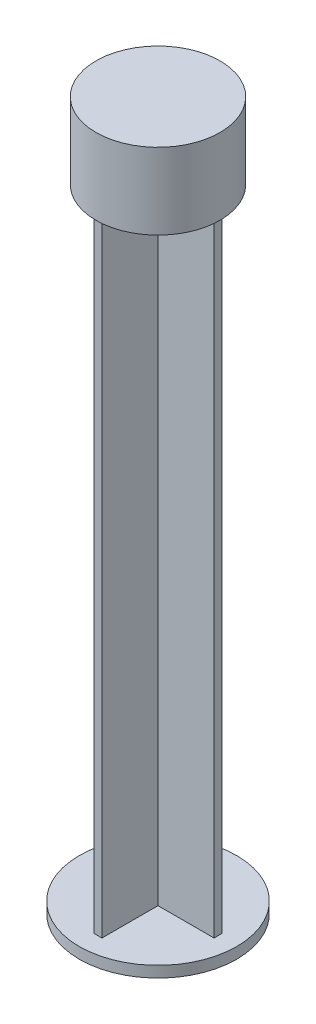
ISO-10303-21;
HEADER;
FILE_DESCRIPTION(('STEP AP214'),'2;1');
FILE_NAME('part.step','',(''),(''),'','','');
FILE_SCHEMA(('AUTOMOTIVE_DESIGN { 1 0 10303 214 1 1 1 1 }'));
ENDSEC;
DATA;
#1=APPLICATION_CONTEXT('core data for automotive mechanical design processes');
#2=APPLICATION_PROTOCOL_DEFINITION('international standard','automotive_design',2000,#1);
#3=PRODUCT_CONTEXT('',#1,'mechanical');
#4=PRODUCT('Part','Part','',(#3));
#5=PRODUCT_RELATED_PRODUCT_CATEGORY('part','',(#4));
#6=PRODUCT_DEFINITION_FORMATION('','',#4);
#7=PRODUCT_DEFINITION_CONTEXT('part definition',#1,'design');
#8=PRODUCT_DEFINITION('design','',#6,#7);
#9=PRODUCT_DEFINITION_SHAPE('','',#8);
#10=(LENGTH_UNIT() NAMED_UNIT(*) SI_UNIT(.MILLI.,.METRE.));
#11=(NAMED_UNIT(*) PLANE_ANGLE_UNIT() SI_UNIT($,.RADIAN.));
#12=(NAMED_UNIT(*) SI_UNIT($,.STERADIAN.) SOLID_ANGLE_UNIT());
#13=UNCERTAINTY_MEASURE_WITH_UNIT(LENGTH_MEASURE(1.E-05),#10,'distance_accuracy_value','');
#14=(GEOMETRIC_REPRESENTATION_CONTEXT(3) GLOBAL_UNCERTAINTY_ASSIGNED_CONTEXT((#13)) GLOBAL_UNIT_ASSIGNED_CONTEXT((#10,
#11,#12)) REPRESENTATION_CONTEXT('',''));
#15=CARTESIAN_POINT('',(0.,0.,0.));
#16=DIRECTION('',(0.,0.,1.));
#17=DIRECTION('',(1.,0.,0.));
#18=AXIS2_PLACEMENT_3D('',#15,#16,#17);
#19=CARTESIAN_POINT('',(0.,2.76,0.));
#20=DIRECTION('',(0.,-1.,0.));
#21=DIRECTION('',(0.,0.,-1.));
#22=AXIS2_PLACEMENT_3D('',#19,#20,#21);
#23=CYLINDRICAL_SURFACE('',#22,19.675);
#24=CARTESIAN_POINT('',(0.,2.76,0.));
#25=DIRECTION('',(0.,1.,0.));
#26=DIRECTION('',(0.,0.,1.));
#27=AXIS2_PLACEMENT_3D('',#24,#25,#26);
#28=CIRCLE('',#27,19.675);
#29=CARTESIAN_POINT('',(0.,2.76,19.675));
#30=VERTEX_POINT('',#29);
#31=EDGE_CURVE('E11',#30,#30,#28,.T.);
#32=ORIENTED_EDGE('',*,*,#31,.F.);
#33=EDGE_LOOP('',(#32));
#34=FACE_BOUND('',#33,.T.);
#35=CARTESIAN_POINT('',(0.,0.,0.));
#36=DIRECTION('',(0.,1.,0.));
#37=DIRECTION('',(0.,0.,1.));
#38=AXIS2_PLACEMENT_3D('',#35,#36,#37);
#39=CIRCLE('',#38,19.675);
#40=CARTESIAN_POINT('',(0.,0.,19.675));
#41=VERTEX_POINT('',#40);
#42=EDGE_CURVE('E44',#41,#41,#39,.T.);
#43=ORIENTED_EDGE('',*,*,#42,.T.);
#44=EDGE_LOOP('',(#43));
#45=FACE_BOUND('',#44,.T.);
#46=ADVANCED_FACE('F41',(#34,#45),#23,.T.);
#47=CARTESIAN_POINT('',(0.,2.76,0.));
#48=DIRECTION('',(0.,1.,0.));
#49=DIRECTION('',(0.,0.,1.));
#50=AXIS2_PLACEMENT_3D('',#47,#48,#49);
#51=PLANE('',#50);
#52=DIRECTION('',(0.,0.,-1.));
#53=VECTOR('',#52,1.);
#54=CARTESIAN_POINT('',(-1.,2.76,0.));
#55=LINE('',#54,#53);
#56=CARTESIAN_POINT('',(-1.,2.76,-1.00000000000001));
#57=VERTEX_POINT('',#56);
#58=CARTESIAN_POINT('',(-1.,2.76,-15.));
#59=VERTEX_POINT('',#58);
#60=EDGE_CURVE('E197',#57,#59,#55,.T.);
#61=ORIENTED_EDGE('',*,*,#60,.T.);
#62=DIRECTION('',(1.,0.,0.));
#63=VECTOR('',#62,1.);
#64=CARTESIAN_POINT('',(0.,2.76,-15.));
#65=LINE('',#64,#63);
#66=CARTESIAN_POINT('',(1.,2.76,-15.));
#67=VERTEX_POINT('',#66);
#68=EDGE_CURVE('E146',#59,#67,#65,.T.);
#69=ORIENTED_EDGE('',*,*,#68,.T.);
#70=DIRECTION('',(0.,0.,-1.));
#71=VECTOR('',#70,1.);
#72=CARTESIAN_POINT('',(1.,2.76,0.));
#73=LINE('',#72,#71);
#74=CARTESIAN_POINT('',(1.,2.76,-1.00000000000001));
#75=VERTEX_POINT('',#74);
#76=EDGE_CURVE('E162',#75,#67,#73,.T.);
#77=ORIENTED_EDGE('',*,*,#76,.F.);
#78=DIRECTION('',(-1.,0.,0.));
#79=VECTOR('',#78,1.);
#80=CARTESIAN_POINT('',(0.,2.76,-1.00000000000001));
#81=LINE('',#80,#79);
#82=CARTESIAN_POINT('',(15.,2.76,-1.00000000000001));
#83=VERTEX_POINT('',#82);
#84=EDGE_CURVE('E226',#83,#75,#81,.T.);
#85=ORIENTED_EDGE('',*,*,#84,.F.);
#86=DIRECTION('',(0.,0.,-1.));
#87=VECTOR('',#86,1.);
#88=CARTESIAN_POINT('',(15.,2.76,0.));
#89=LINE('',#88,#87);
#90=CARTESIAN_POINT('',(15.,2.76,0.999999999999989));
#91=VERTEX_POINT('',#90);
#92=EDGE_CURVE('E222',#91,#83,#89,.T.);
#93=ORIENTED_EDGE('',*,*,#92,.F.);
#94=DIRECTION('',(-1.,0.,0.));
#95=VECTOR('',#94,1.);
#96=CARTESIAN_POINT('',(0.,2.76,0.999999999999991));
#97=LINE('',#96,#95);
#98=CARTESIAN_POINT('',(1.,2.76,0.999999999999991));
#99=VERTEX_POINT('',#98);
#100=EDGE_CURVE('E219',#91,#99,#97,.T.);
#101=ORIENTED_EDGE('',*,*,#100,.T.);
#102=DIRECTION('',(0.,0.,-1.));
#103=VECTOR('',#102,1.);
#104=CARTESIAN_POINT('',(1.,2.76,0.));
#105=LINE('',#104,#103);
#106=CARTESIAN_POINT('',(1.,2.76,15.));
#107=VERTEX_POINT('',#106);
#108=EDGE_CURVE('E215',#107,#99,#105,.T.);
#109=ORIENTED_EDGE('',*,*,#108,.F.);
#110=DIRECTION('',(1.,0.,0.));
#111=VECTOR('',#110,1.);
#112=CARTESIAN_POINT('',(0.,2.76,15.));
#113=LINE('',#112,#111);
#114=CARTESIAN_POINT('',(-1.,2.76,15.));
#115=VERTEX_POINT('',#114);
#116=EDGE_CURVE('E211',#115,#107,#113,.T.);
#117=ORIENTED_EDGE('',*,*,#116,.F.);
#118=DIRECTION('',(0.,0.,-1.));
#119=VECTOR('',#118,1.);
#120=CARTESIAN_POINT('',(-1.,2.76,0.));
#121=LINE('',#120,#119);
#122=CARTESIAN_POINT('',(-1.,2.76,0.999999999999991));
#123=VERTEX_POINT('',#122);
#124=EDGE_CURVE('E208',#115,#123,#121,.T.);
#125=ORIENTED_EDGE('',*,*,#124,.T.);
#126=DIRECTION('',(-1.,0.,0.));
#127=VECTOR('',#126,1.);
#128=CARTESIAN_POINT('',(0.,2.76,0.999999999999991));
#129=LINE('',#128,#127);
#130=CARTESIAN_POINT('',(-15.,2.76,0.999999999999993));
#131=VERTEX_POINT('',#130);
#132=EDGE_CURVE('E205',#123,#131,#129,.T.);
#133=ORIENTED_EDGE('',*,*,#132,.T.);
#134=DIRECTION('',(0.,0.,-1.));
#135=VECTOR('',#134,1.);
#136=CARTESIAN_POINT('',(-15.,2.76,0.));
#137=LINE('',#136,#135);
#138=CARTESIAN_POINT('',(-15.,2.76,-1.00000000000001));
#139=VERTEX_POINT('',#138);
#140=EDGE_CURVE('E61',#131,#139,#137,.T.);
#141=ORIENTED_EDGE('',*,*,#140,.T.);
#142=DIRECTION('',(-1.,0.,0.));
#143=VECTOR('',#142,1.);
#144=CARTESIAN_POINT('',(0.,2.76,-1.00000000000001));
#145=LINE('',#144,#143);
#146=EDGE_CURVE('E56',#57,#139,#145,.T.);
#147=ORIENTED_EDGE('',*,*,#146,.F.);
#148=EDGE_LOOP('',(#61,#69,#77,#85,#93,#101,#109,#117,#125,#133,#141,#147));
#149=FACE_BOUND('',#148,.T.);
#150=ORIENTED_EDGE('',*,*,#31,.T.);
#151=EDGE_LOOP('',(#150));
#152=FACE_BOUND('',#151,.T.);
#153=ADVANCED_FACE('F279',(#149,#152),#51,.T.);
#154=CARTESIAN_POINT('',(0.,0.,0.));
#155=DIRECTION('',(0.,1.,0.));
#156=DIRECTION('',(0.,0.,1.));
#157=AXIS2_PLACEMENT_3D('',#154,#155,#156);
#158=PLANE('',#157);
#159=ORIENTED_EDGE('',*,*,#42,.F.);
#160=EDGE_LOOP('',(#159));
#161=FACE_BOUND('',#160,.T.);
#162=ADVANCED_FACE('F277',(#161),#158,.F.);
#163=CARTESIAN_POINT('',(-1.,157.76,0.));
#164=DIRECTION('',(-1.,0.,0.));
#165=DIRECTION('',(0.,0.,1.));
#166=AXIS2_PLACEMENT_3D('',#163,#164,#165);
#167=PLANE('',#166);
#168=ORIENTED_EDGE('',*,*,#60,.F.);
#169=DIRECTION('',(0.,-1.,0.));
#170=VECTOR('',#169,1.);
#171=CARTESIAN_POINT('',(-1.,157.76,-1.00000000000001));
#172=LINE('',#171,#170);
#173=CARTESIAN_POINT('',(-1.,157.76,-1.00000000000001));
#174=VERTEX_POINT('',#173);
#175=EDGE_CURVE('E153',#174,#57,#172,.T.);
#176=ORIENTED_EDGE('',*,*,#175,.F.);
#177=DIRECTION('',(0.,0.,-1.));
#178=VECTOR('',#177,1.);
#179=CARTESIAN_POINT('',(-1.,157.76,0.));
#180=LINE('',#179,#178);
#181=CARTESIAN_POINT('',(-1.,157.76,-15.));
#182=VERTEX_POINT('',#181);
#183=EDGE_CURVE('E133',#174,#182,#180,.T.);
#184=ORIENTED_EDGE('',*,*,#183,.T.);
#185=DIRECTION('',(0.,-1.,0.));
#186=VECTOR('',#185,1.);
#187=CARTESIAN_POINT('',(-1.,157.76,-15.));
#188=LINE('',#187,#186);
#189=EDGE_CURVE('E141',#182,#59,#188,.T.);
#190=ORIENTED_EDGE('',*,*,#189,.T.);
#191=EDGE_LOOP('',(#168,#176,#184,#190));
#192=FACE_BOUND('',#191,.T.);
#193=ADVANCED_FACE('F152',(#192),#167,.T.);
#194=CARTESIAN_POINT('',(0.,157.76,-1.00000000000001));
#195=DIRECTION('',(0.,0.,1.));
#196=DIRECTION('',(1.,0.,0.));
#197=AXIS2_PLACEMENT_3D('',#194,#195,#196);
#198=PLANE('',#197);
#199=ORIENTED_EDGE('',*,*,#146,.T.);
#200=DIRECTION('',(0.,-1.,0.));
#201=VECTOR('',#200,1.);
#202=CARTESIAN_POINT('',(-15.,157.76,-1.00000000000001));
#203=LINE('',#202,#201);
#204=CARTESIAN_POINT('',(-15.,157.76,-1.00000000000001));
#205=VERTEX_POINT('',#204);
#206=EDGE_CURVE('E267',#205,#139,#203,.T.);
#207=ORIENTED_EDGE('',*,*,#206,.F.);
#208=DIRECTION('',(-1.,0.,0.));
#209=VECTOR('',#208,1.);
#210=CARTESIAN_POINT('',(0.,157.76,-1.00000000000001));
#211=LINE('',#210,#209);
#212=EDGE_CURVE('E156',#174,#205,#211,.T.);
#213=ORIENTED_EDGE('',*,*,#212,.F.);
#214=ORIENTED_EDGE('',*,*,#175,.T.);
#215=EDGE_LOOP('',(#199,#207,#213,#214));
#216=FACE_BOUND('',#215,.T.);
#217=ADVANCED_FACE('F284',(#216),#198,.F.);
#218=CARTESIAN_POINT('',(-15.,157.76,0.));
#219=DIRECTION('',(-1.,0.,0.));
#220=DIRECTION('',(0.,0.,1.));
#221=AXIS2_PLACEMENT_3D('',#218,#219,#220);
#222=PLANE('',#221);
#223=ORIENTED_EDGE('',*,*,#140,.F.);
#224=DIRECTION('',(0.,-1.,0.));
#225=VECTOR('',#224,1.);
#226=CARTESIAN_POINT('',(-15.,157.76,0.999999999999993));
#227=LINE('',#226,#225);
#228=CARTESIAN_POINT('',(-15.,157.76,0.999999999999993));
#229=VERTEX_POINT('',#228);
#230=EDGE_CURVE('E263',#229,#131,#227,.T.);
#231=ORIENTED_EDGE('',*,*,#230,.F.);
#232=DIRECTION('',(0.,0.,-1.));
#233=VECTOR('',#232,1.);
#234=CARTESIAN_POINT('',(-15.,157.76,0.));
#235=LINE('',#234,#233);
#236=EDGE_CURVE('E160',#229,#205,#235,.T.);
#237=ORIENTED_EDGE('',*,*,#236,.T.);
#238=ORIENTED_EDGE('',*,*,#206,.T.);
#239=EDGE_LOOP('',(#223,#231,#237,#238));
#240=FACE_BOUND('',#239,.T.);
#241=ADVANCED_FACE('F314',(#240),#222,.T.);
#242=CARTESIAN_POINT('',(0.,157.76,0.999999999999991));
#243=DIRECTION('',(0.,0.,1.));
#244=DIRECTION('',(1.,0.,0.));
#245=AXIS2_PLACEMENT_3D('',#242,#243,#244);
#246=PLANE('',#245);
#247=ORIENTED_EDGE('',*,*,#132,.F.);
#248=DIRECTION('',(0.,-1.,0.));
#249=VECTOR('',#248,1.);
#250=CARTESIAN_POINT('',(-1.,157.76,0.999999999999991));
#251=LINE('',#250,#249);
#252=CARTESIAN_POINT('',(-1.,157.76,0.999999999999991));
#253=VERTEX_POINT('',#252);
#254=EDGE_CURVE('E259',#253,#123,#251,.T.);
#255=ORIENTED_EDGE('',*,*,#254,.F.);
#256=DIRECTION('',(-1.,0.,0.));
#257=VECTOR('',#256,1.);
#258=CARTESIAN_POINT('',(0.,157.76,0.999999999999991));
#259=LINE('',#258,#257);
#260=EDGE_CURVE('E171',#253,#229,#259,.T.);
#261=ORIENTED_EDGE('',*,*,#260,.T.);
#262=ORIENTED_EDGE('',*,*,#230,.T.);
#263=EDGE_LOOP('',(#247,#255,#261,#262));
#264=FACE_BOUND('',#263,.T.);
#265=ADVANCED_FACE('F323',(#264),#246,.T.);
#266=CARTESIAN_POINT('',(-1.,157.76,0.));
#267=DIRECTION('',(-1.,0.,0.));
#268=DIRECTION('',(0.,0.,1.));
#269=AXIS2_PLACEMENT_3D('',#266,#267,#268);
#270=PLANE('',#269);
#271=ORIENTED_EDGE('',*,*,#124,.F.);
#272=DIRECTION('',(0.,-1.,0.));
#273=VECTOR('',#272,1.);
#274=CARTESIAN_POINT('',(-1.,157.76,15.));
#275=LINE('',#274,#273);
#276=CARTESIAN_POINT('',(-1.,157.76,15.));
#277=VERTEX_POINT('',#276);
#278=EDGE_CURVE('E255',#277,#115,#275,.T.);
#279=ORIENTED_EDGE('',*,*,#278,.F.);
#280=DIRECTION('',(0.,0.,-1.));
#281=VECTOR('',#280,1.);
#282=CARTESIAN_POINT('',(-1.,157.76,0.));
#283=LINE('',#282,#281);
#284=EDGE_CURVE('E175',#277,#253,#283,.T.);
#285=ORIENTED_EDGE('',*,*,#284,.T.);
#286=ORIENTED_EDGE('',*,*,#254,.T.);
#287=EDGE_LOOP('',(#271,#279,#285,#286));
#288=FACE_BOUND('',#287,.T.);
#289=ADVANCED_FACE('F333',(#288),#270,.T.);
#290=CARTESIAN_POINT('',(0.,157.76,15.));
#291=DIRECTION('',(0.,0.,-1.));
#292=DIRECTION('',(-1.,0.,0.));
#293=AXIS2_PLACEMENT_3D('',#290,#291,#292);
#294=PLANE('',#293);
#295=ORIENTED_EDGE('',*,*,#116,.T.);
#296=DIRECTION('',(0.,-1.,0.));
#297=VECTOR('',#296,1.);
#298=CARTESIAN_POINT('',(1.,157.76,15.));
#299=LINE('',#298,#297);
#300=CARTESIAN_POINT('',(1.,157.76,15.));
#301=VERTEX_POINT('',#300);
#302=EDGE_CURVE('E251',#301,#107,#299,.T.);
#303=ORIENTED_EDGE('',*,*,#302,.F.);
#304=DIRECTION('',(1.,0.,0.));
#305=VECTOR('',#304,1.);
#306=CARTESIAN_POINT('',(0.,157.76,15.));
#307=LINE('',#306,#305);
#308=EDGE_CURVE('E179',#277,#301,#307,.T.);
#309=ORIENTED_EDGE('',*,*,#308,.F.);
#310=ORIENTED_EDGE('',*,*,#278,.T.);
#311=EDGE_LOOP('',(#295,#303,#309,#310));
#312=FACE_BOUND('',#311,.T.);
#313=ADVANCED_FACE('F343',(#312),#294,.F.);
#314=CARTESIAN_POINT('',(1.,157.76,0.));
#315=DIRECTION('',(-1.,0.,0.));
#316=DIRECTION('',(0.,0.,1.));
#317=AXIS2_PLACEMENT_3D('',#314,#315,#316);
#318=PLANE('',#317);
#319=ORIENTED_EDGE('',*,*,#108,.T.);
#320=DIRECTION('',(0.,-1.,0.));
#321=VECTOR('',#320,1.);
#322=CARTESIAN_POINT('',(1.,157.76,0.999999999999991));
#323=LINE('',#322,#321);
#324=CARTESIAN_POINT('',(1.,157.76,0.999999999999991));
#325=VERTEX_POINT('',#324);
#326=EDGE_CURVE('E247',#325,#99,#323,.T.);
#327=ORIENTED_EDGE('',*,*,#326,.F.);
#328=DIRECTION('',(0.,0.,-1.));
#329=VECTOR('',#328,1.);
#330=CARTESIAN_POINT('',(1.,157.76,0.));
#331=LINE('',#330,#329);
#332=EDGE_CURVE('E182',#301,#325,#331,.T.);
#333=ORIENTED_EDGE('',*,*,#332,.F.);
#334=ORIENTED_EDGE('',*,*,#302,.T.);
#335=EDGE_LOOP('',(#319,#327,#333,#334));
#336=FACE_BOUND('',#335,.T.);
#337=ADVANCED_FACE('F353',(#336),#318,.F.);
#338=CARTESIAN_POINT('',(0.,157.76,0.999999999999991));
#339=DIRECTION('',(0.,0.,1.));
#340=DIRECTION('',(1.,0.,0.));
#341=AXIS2_PLACEMENT_3D('',#338,#339,#340);
#342=PLANE('',#341);
#343=ORIENTED_EDGE('',*,*,#100,.F.);
#344=DIRECTION('',(0.,-1.,0.));
#345=VECTOR('',#344,1.);
#346=CARTESIAN_POINT('',(15.,157.76,0.999999999999989));
#347=LINE('',#346,#345);
#348=CARTESIAN_POINT('',(15.,157.76,0.999999999999989));
#349=VERTEX_POINT('',#348);
#350=EDGE_CURVE('E243',#349,#91,#347,.T.);
#351=ORIENTED_EDGE('',*,*,#350,.F.);
#352=DIRECTION('',(-1.,0.,0.));
#353=VECTOR('',#352,1.);
#354=CARTESIAN_POINT('',(0.,157.76,0.999999999999991));
#355=LINE('',#354,#353);
#356=EDGE_CURVE('E185',#349,#325,#355,.T.);
#357=ORIENTED_EDGE('',*,*,#356,.T.);
#358=ORIENTED_EDGE('',*,*,#326,.T.);
#359=EDGE_LOOP('',(#343,#351,#357,#358));
#360=FACE_BOUND('',#359,.T.);
#361=ADVANCED_FACE('F363',(#360),#342,.T.);
#362=CARTESIAN_POINT('',(15.,157.76,0.));
#363=DIRECTION('',(-1.,0.,0.));
#364=DIRECTION('',(0.,0.,1.));
#365=AXIS2_PLACEMENT_3D('',#362,#363,#364);
#366=PLANE('',#365);
#367=ORIENTED_EDGE('',*,*,#92,.T.);
#368=DIRECTION('',(0.,-1.,0.));
#369=VECTOR('',#368,1.);
#370=CARTESIAN_POINT('',(15.,157.76,-1.00000000000001));
#371=LINE('',#370,#369);
#372=CARTESIAN_POINT('',(15.,157.76,-1.00000000000001));
#373=VERTEX_POINT('',#372);
#374=EDGE_CURVE('E239',#373,#83,#371,.T.);
#375=ORIENTED_EDGE('',*,*,#374,.F.);
#376=DIRECTION('',(0.,0.,-1.));
#377=VECTOR('',#376,1.);
#378=CARTESIAN_POINT('',(15.,157.76,0.));
#379=LINE('',#378,#377);
#380=EDGE_CURVE('E189',#349,#373,#379,.T.);
#381=ORIENTED_EDGE('',*,*,#380,.F.);
#382=ORIENTED_EDGE('',*,*,#350,.T.);
#383=EDGE_LOOP('',(#367,#375,#381,#382));
#384=FACE_BOUND('',#383,.T.);
#385=ADVANCED_FACE('F373',(#384),#366,.F.);
#386=CARTESIAN_POINT('',(0.,157.76,-1.00000000000001));
#387=DIRECTION('',(0.,0.,1.));
#388=DIRECTION('',(1.,0.,0.));
#389=AXIS2_PLACEMENT_3D('',#386,#387,#388);
#390=PLANE('',#389);
#391=ORIENTED_EDGE('',*,*,#84,.T.);
#392=DIRECTION('',(0.,-1.,0.));
#393=VECTOR('',#392,1.);
#394=CARTESIAN_POINT('',(1.,157.76,-1.00000000000001));
#395=LINE('',#394,#393);
#396=CARTESIAN_POINT('',(1.,157.76,-1.00000000000001));
#397=VERTEX_POINT('',#396);
#398=EDGE_CURVE('E235',#397,#75,#395,.T.);
#399=ORIENTED_EDGE('',*,*,#398,.F.);
#400=DIRECTION('',(-1.,0.,0.));
#401=VECTOR('',#400,1.);
#402=CARTESIAN_POINT('',(0.,157.76,-1.00000000000001));
#403=LINE('',#402,#401);
#404=EDGE_CURVE('E192',#373,#397,#403,.T.);
#405=ORIENTED_EDGE('',*,*,#404,.F.);
#406=ORIENTED_EDGE('',*,*,#374,.T.);
#407=EDGE_LOOP('',(#391,#399,#405,#406));
#408=FACE_BOUND('',#407,.T.);
#409=ADVANCED_FACE('F383',(#408),#390,.F.);
#410=CARTESIAN_POINT('',(1.,157.76,0.));
#411=DIRECTION('',(-1.,0.,0.));
#412=DIRECTION('',(0.,0.,1.));
#413=AXIS2_PLACEMENT_3D('',#410,#411,#412);
#414=PLANE('',#413);
#415=ORIENTED_EDGE('',*,*,#76,.T.);
#416=DIRECTION('',(0.,-1.,0.));
#417=VECTOR('',#416,1.);
#418=CARTESIAN_POINT('',(1.,157.76,-15.));
#419=LINE('',#418,#417);
#420=CARTESIAN_POINT('',(1.,157.76,-15.));
#421=VERTEX_POINT('',#420);
#422=EDGE_CURVE('E150',#421,#67,#419,.T.);
#423=ORIENTED_EDGE('',*,*,#422,.F.);
#424=DIRECTION('',(0.,0.,-1.));
#425=VECTOR('',#424,1.);
#426=CARTESIAN_POINT('',(1.,157.76,0.));
#427=LINE('',#426,#425);
#428=EDGE_CURVE('E136',#397,#421,#427,.T.);
#429=ORIENTED_EDGE('',*,*,#428,.F.);
#430=ORIENTED_EDGE('',*,*,#398,.T.);
#431=EDGE_LOOP('',(#415,#423,#429,#430));
#432=FACE_BOUND('',#431,.T.);
#433=ADVANCED_FACE('F393',(#432),#414,.F.);
#434=CARTESIAN_POINT('',(0.,157.76,-15.));
#435=DIRECTION('',(0.,0.,-1.));
#436=DIRECTION('',(-1.,0.,0.));
#437=AXIS2_PLACEMENT_3D('',#434,#435,#436);
#438=PLANE('',#437);
#439=ORIENTED_EDGE('',*,*,#68,.F.);
#440=ORIENTED_EDGE('',*,*,#189,.F.);
#441=DIRECTION('',(1.,0.,0.));
#442=VECTOR('',#441,1.);
#443=CARTESIAN_POINT('',(0.,157.76,-15.));
#444=LINE('',#443,#442);
#445=EDGE_CURVE('E128',#182,#421,#444,.T.);
#446=ORIENTED_EDGE('',*,*,#445,.T.);
#447=ORIENTED_EDGE('',*,*,#422,.T.);
#448=EDGE_LOOP('',(#439,#440,#446,#447));
#449=FACE_BOUND('',#448,.T.);
#450=ADVANCED_FACE('F145',(#449),#438,.T.);
#451=CARTESIAN_POINT('',(0.,176.76,0.));
#452=DIRECTION('',(0.,-1.,0.));
#453=DIRECTION('',(0.,0.,-1.));
#454=AXIS2_PLACEMENT_3D('',#451,#452,#453);
#455=CYLINDRICAL_SURFACE('',#454,15.5);
#456=CARTESIAN_POINT('',(0.,176.76,0.));
#457=DIRECTION('',(0.,1.,0.));
#458=DIRECTION('',(0.,0.,1.));
#459=AXIS2_PLACEMENT_3D('',#456,#457,#458);
#460=CIRCLE('',#459,15.5);
#461=CARTESIAN_POINT('',(0.,176.76,15.5));
#462=VERTEX_POINT('',#461);
#463=EDGE_CURVE('E200',#462,#462,#460,.T.);
#464=ORIENTED_EDGE('',*,*,#463,.F.);
#465=EDGE_LOOP('',(#464));
#466=FACE_BOUND('',#465,.T.);
#467=CARTESIAN_POINT('',(0.,157.76,0.));
#468=DIRECTION('',(0.,1.,0.));
#469=DIRECTION('',(0.,0.,1.));
#470=AXIS2_PLACEMENT_3D('',#467,#468,#469);
#471=CIRCLE('',#470,15.5);
#472=CARTESIAN_POINT('',(0.,157.76,15.5));
#473=VERTEX_POINT('',#472);
#474=EDGE_CURVE('E165',#473,#473,#471,.T.);
#475=ORIENTED_EDGE('',*,*,#474,.T.);
#476=EDGE_LOOP('',(#475));
#477=FACE_BOUND('',#476,.T.);
#478=ADVANCED_FACE('F412',(#466,#477),#455,.T.);
#479=CARTESIAN_POINT('',(0.,176.76,0.));
#480=DIRECTION('',(0.,1.,0.));
#481=DIRECTION('',(0.,0.,1.));
#482=AXIS2_PLACEMENT_3D('',#479,#480,#481);
#483=PLANE('',#482);
#484=ORIENTED_EDGE('',*,*,#463,.T.);
#485=EDGE_LOOP('',(#484));
#486=FACE_BOUND('',#485,.T.);
#487=ADVANCED_FACE('F421',(#486),#483,.T.);
#488=CARTESIAN_POINT('',(0.,157.76,0.));
#489=DIRECTION('',(0.,1.,0.));
#490=DIRECTION('',(0.,0.,1.));
#491=AXIS2_PLACEMENT_3D('',#488,#489,#490);
#492=PLANE('',#491);
#493=ORIENTED_EDGE('',*,*,#183,.F.);
#494=ORIENTED_EDGE('',*,*,#212,.T.);
#495=ORIENTED_EDGE('',*,*,#236,.F.);
#496=ORIENTED_EDGE('',*,*,#260,.F.);
#497=ORIENTED_EDGE('',*,*,#284,.F.);
#498=ORIENTED_EDGE('',*,*,#308,.T.);
#499=ORIENTED_EDGE('',*,*,#332,.T.);
#500=ORIENTED_EDGE('',*,*,#356,.F.);
#501=ORIENTED_EDGE('',*,*,#380,.T.);
#502=ORIENTED_EDGE('',*,*,#404,.T.);
#503=ORIENTED_EDGE('',*,*,#428,.T.);
#504=ORIENTED_EDGE('',*,*,#445,.F.);
#505=EDGE_LOOP('',(#493,#494,#495,#496,#497,#498,#499,#500,#501,#502,#503,#504));
#506=FACE_BOUND('',#505,.T.);
#507=ORIENTED_EDGE('',*,*,#474,.F.);
#508=EDGE_LOOP('',(#507));
#509=FACE_BOUND('',#508,.T.);
#510=ADVANCED_FACE('F130',(#506,#509),#492,.F.);
#511=CLOSED_SHELL('',(#46,#153,#162,#193,#217,#241,#265,#289,#313,#337,#361,#385,#409,#433,#450,
#478,#487,#510));
#512=MANIFOLD_SOLID_BREP('B2',#511);
#513=ADVANCED_BREP_SHAPE_REPRESENTATION('',(#18,#512),#14);
#514=SHAPE_DEFINITION_REPRESENTATION(#9,#513);
ENDSEC;
END-ISO-10303-21;
